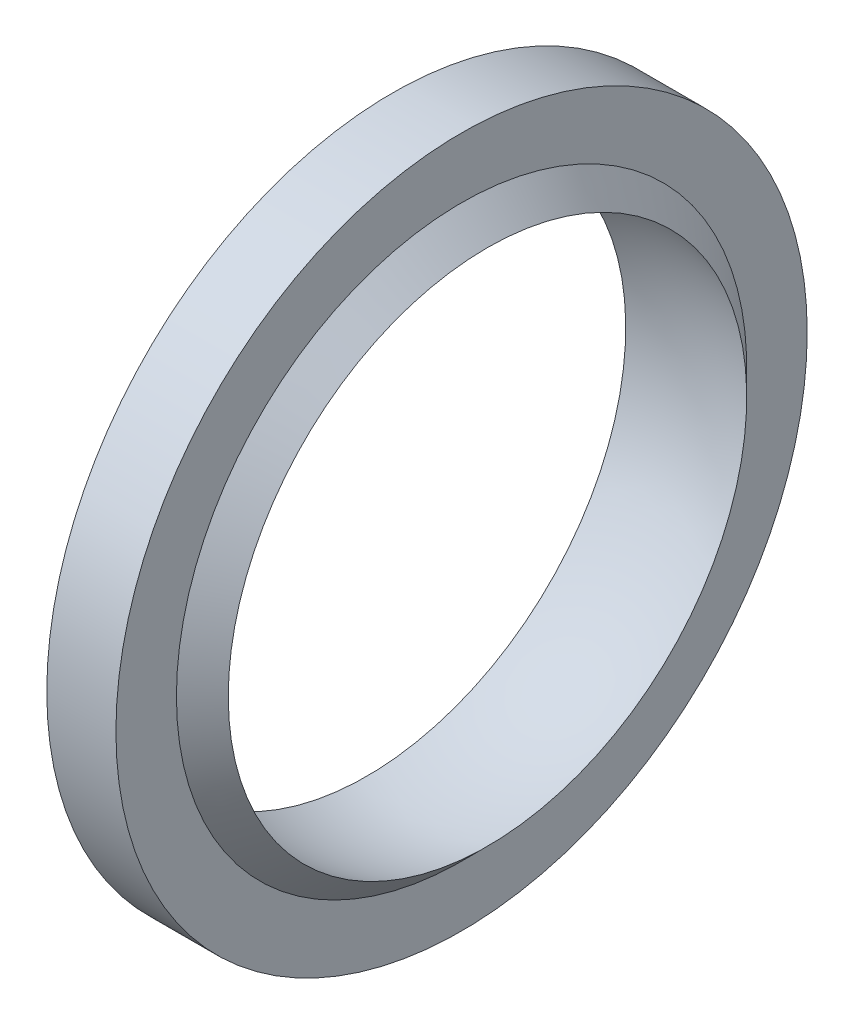
ISO-10303-21;
HEADER;
FILE_DESCRIPTION(('STEP AP214'),'2;1');
FILE_NAME('part.step','',(''),(''),'','','');
FILE_SCHEMA(('AUTOMOTIVE_DESIGN { 1 0 10303 214 1 1 1 1 }'));
ENDSEC;
DATA;
#1=APPLICATION_CONTEXT('core data for automotive mechanical design processes');
#2=APPLICATION_PROTOCOL_DEFINITION('international standard','automotive_design',2000,#1);
#3=PRODUCT_CONTEXT('',#1,'mechanical');
#4=PRODUCT('Part','Part','',(#3));
#5=PRODUCT_RELATED_PRODUCT_CATEGORY('part','',(#4));
#6=PRODUCT_DEFINITION_FORMATION('','',#4);
#7=PRODUCT_DEFINITION_CONTEXT('part definition',#1,'design');
#8=PRODUCT_DEFINITION('design','',#6,#7);
#9=PRODUCT_DEFINITION_SHAPE('','',#8);
#10=(LENGTH_UNIT() NAMED_UNIT(*) SI_UNIT(.MILLI.,.METRE.));
#11=(NAMED_UNIT(*) PLANE_ANGLE_UNIT() SI_UNIT($,.RADIAN.));
#12=(NAMED_UNIT(*) SI_UNIT($,.STERADIAN.) SOLID_ANGLE_UNIT());
#13=UNCERTAINTY_MEASURE_WITH_UNIT(LENGTH_MEASURE(1.E-05),#10,'distance_accuracy_value','');
#14=(GEOMETRIC_REPRESENTATION_CONTEXT(3) GLOBAL_UNCERTAINTY_ASSIGNED_CONTEXT((#13)) GLOBAL_UNIT_ASSIGNED_CONTEXT((#10,
#11,#12)) REPRESENTATION_CONTEXT('',''));
#15=CARTESIAN_POINT('',(0.,0.,0.));
#16=DIRECTION('',(0.,0.,1.));
#17=DIRECTION('',(1.,0.,0.));
#18=AXIS2_PLACEMENT_3D('',#15,#16,#17);
#19=CARTESIAN_POINT('',(-2.,20.,0.));
#20=DIRECTION('',(1.,0.,0.));
#21=DIRECTION('',(0.,0.,-1.));
#22=AXIS2_PLACEMENT_3D('',#19,#20,#21);
#23=PLANE('',#22);
#24=CARTESIAN_POINT('',(-2.,0.,0.));
#25=DIRECTION('',(-1.,0.,0.));
#26=DIRECTION('',(0.,0.,1.));
#27=AXIS2_PLACEMENT_3D('',#24,#25,#26);
#28=CIRCLE('',#27,16.5);
#29=CARTESIAN_POINT('',(-2.,0.,16.5));
#30=VERTEX_POINT('',#29);
#31=EDGE_CURVE('E60',#30,#30,#28,.T.);
#32=ORIENTED_EDGE('',*,*,#31,.F.);
#33=EDGE_LOOP('',(#32));
#34=FACE_BOUND('',#33,.T.);
#35=CARTESIAN_POINT('',(-2.,0.,0.));
#36=DIRECTION('',(-1.,0.,0.));
#37=DIRECTION('',(0.,0.,1.));
#38=AXIS2_PLACEMENT_3D('',#35,#36,#37);
#39=CIRCLE('',#38,20.);
#40=CARTESIAN_POINT('',(-2.,0.,20.));
#41=VERTEX_POINT('',#40);
#42=EDGE_CURVE('E10',#41,#41,#39,.T.);
#43=ORIENTED_EDGE('',*,*,#42,.T.);
#44=EDGE_LOOP('',(#43));
#45=FACE_BOUND('',#44,.T.);
#46=ADVANCED_FACE('F34',(#34,#45),#23,.F.);
#47=CARTESIAN_POINT('',(0.,0.,0.));
#48=DIRECTION('',(-1.,0.,0.));
#49=DIRECTION('',(0.,0.,1.));
#50=AXIS2_PLACEMENT_3D('',#47,#48,#49);
#51=CYLINDRICAL_SURFACE('',#50,20.);
#52=ORIENTED_EDGE('',*,*,#42,.F.);
#53=EDGE_LOOP('',(#52));
#54=FACE_BOUND('',#53,.T.);
#55=CARTESIAN_POINT('',(2.,0.,0.));
#56=DIRECTION('',(-1.,0.,0.));
#57=DIRECTION('',(0.,0.,1.));
#58=AXIS2_PLACEMENT_3D('',#55,#56,#57);
#59=CIRCLE('',#58,20.);
#60=CARTESIAN_POINT('',(2.,0.,20.));
#61=VERTEX_POINT('',#60);
#62=EDGE_CURVE('E41',#61,#61,#59,.T.);
#63=ORIENTED_EDGE('',*,*,#62,.T.);
#64=EDGE_LOOP('',(#63));
#65=FACE_BOUND('',#64,.T.);
#66=ADVANCED_FACE('F65',(#54,#65),#51,.T.);
#67=CARTESIAN_POINT('',(2.,20.,0.));
#68=DIRECTION('',(-1.,0.,0.));
#69=DIRECTION('',(0.,0.,1.));
#70=AXIS2_PLACEMENT_3D('',#67,#68,#69);
#71=PLANE('',#70);
#72=ORIENTED_EDGE('',*,*,#62,.F.);
#73=EDGE_LOOP('',(#72));
#74=FACE_BOUND('',#73,.T.);
#75=CARTESIAN_POINT('',(2.,0.,0.));
#76=DIRECTION('',(-1.,0.,0.));
#77=DIRECTION('',(0.,0.,1.));
#78=AXIS2_PLACEMENT_3D('',#75,#76,#77);
#79=CIRCLE('',#78,16.5);
#80=CARTESIAN_POINT('',(2.,0.,16.5));
#81=VERTEX_POINT('',#80);
#82=EDGE_CURVE('E44',#81,#81,#79,.T.);
#83=ORIENTED_EDGE('',*,*,#82,.T.);
#84=EDGE_LOOP('',(#83));
#85=FACE_BOUND('',#84,.T.);
#86=ADVANCED_FACE('F66',(#74,#85),#71,.F.);
#87=CARTESIAN_POINT('',(3.5,0.,0.));
#88=DIRECTION('',(-1.,0.,0.));
#89=DIRECTION('',(0.,0.,1.));
#90=AXIS2_PLACEMENT_3D('',#87,#88,#89);
#91=CONICAL_SURFACE('',#90,15.,0.785398163397448);
#92=ORIENTED_EDGE('',*,*,#82,.F.);
#93=EDGE_LOOP('',(#92));
#94=FACE_BOUND('',#93,.T.);
#95=CARTESIAN_POINT('',(3.5,0.,0.));
#96=DIRECTION('',(-1.,0.,0.));
#97=DIRECTION('',(0.,0.,1.));
#98=AXIS2_PLACEMENT_3D('',#95,#96,#97);
#99=CIRCLE('',#98,15.);
#100=CARTESIAN_POINT('',(3.5,15.,0.));
#101=VERTEX_POINT('',#100);
#102=EDGE_CURVE('E47',#101,#101,#99,.T.);
#103=ORIENTED_EDGE('',*,*,#102,.T.);
#104=EDGE_LOOP('',(#103));
#105=FACE_BOUND('',#104,.T.);
#106=ADVANCED_FACE('F75',(#94,#105),#91,.T.);
#107=CARTESIAN_POINT('',(0.,0.,0.));
#108=DIRECTION('',(-1.,0.,0.));
#109=DIRECTION('',(0.,1.,0.));
#110=AXIS2_PLACEMENT_3D('',#107,#108,#109);
#111=SPHERICAL_SURFACE('',#110,15.4029218007494);
#112=CARTESIAN_POINT('',(-3.5,0.,0.));
#113=DIRECTION('',(-1.,0.,0.));
#114=DIRECTION('',(0.,0.,1.));
#115=AXIS2_PLACEMENT_3D('',#112,#113,#114);
#116=CIRCLE('',#115,15.);
#117=CARTESIAN_POINT('',(-3.5,15.,0.));
#118=VERTEX_POINT('',#117);
#119=EDGE_CURVE('E53',#118,#118,#116,.T.);
#120=CARTESIAN_POINT('',(3.5,15.,0.));
#121=CARTESIAN_POINT('',(3.42836502915106,15.0167148664133,0.));
#122=CARTESIAN_POINT('',(3.35661030526792,15.0329165012953,0.));
#123=CARTESIAN_POINT('',(3.21287611613927,15.064290149139,0.));
#124=CARTESIAN_POINT('',(3.14089665089377,15.0794621621006,0.));
#125=CARTESIAN_POINT('',(2.99672774374648,15.1087734072453,0.));
#126=CARTESIAN_POINT('',(2.9245383018447,15.1229126394284,0.));
#127=CARTESIAN_POINT('',(2.77996426155114,15.1501554327742,0.));
#128=CARTESIAN_POINT('',(2.70757966315937,15.1632589939369,0.));
#129=CARTESIAN_POINT('',(2.56263016679781,15.1884277524076,0.));
#130=CARTESIAN_POINT('',(2.49006526882803,15.2004929497156,0.));
#131=CARTESIAN_POINT('',(2.34477006811805,15.2235825048421,0.));
#132=CARTESIAN_POINT('',(2.27203976537784,15.2346068626606,0.));
#133=CARTESIAN_POINT('',(2.12642868364768,15.255612475726,0.));
#134=CARTESIAN_POINT('',(2.05354790465773,15.2655937309729,0.));
#135=CARTESIAN_POINT('',(1.90765082989909,15.2845110902113,0.));
#136=CARTESIAN_POINT('',(1.83463453413041,15.2934471942028,0.));
#137=CARTESIAN_POINT('',(1.68848141308437,15.3102724166955,0.));
#138=CARTESIAN_POINT('',(1.61534458780701,15.3181615351966,0.));
#139=CARTESIAN_POINT('',(1.46896541975801,15.332891167398,0.));
#140=CARTESIAN_POINT('',(1.39572307698638,15.3397316810983,0.));
#141=CARTESIAN_POINT('',(1.24914790762048,15.3523626996178,0.));
#142=CARTESIAN_POINT('',(1.17581508102621,15.358153204437,0.));
#143=CARTESIAN_POINT('',(1.02907399625966,15.3686830166396,0.));
#144=CARTESIAN_POINT('',(0.955665738087367,15.3734223240231,0.));
#145=CARTESIAN_POINT('',(0.808788857892321,15.3818487685673,0.));
#146=CARTESIAN_POINT('',(0.735320235869564,15.385535905728,0.));
#147=CARTESIAN_POINT('',(0.588337708091403,15.3918572530076,0.));
#148=CARTESIAN_POINT('',(0.514823802335999,15.3944914631265,0.));
#149=CARTESIAN_POINT('',(0.367765796505265,15.3987064156262,0.));
#150=CARTESIAN_POINT('',(0.294221696429935,15.400287158007,0.));
#151=CARTESIAN_POINT('',(0.147118397569737,15.4023948505686,0.));
#152=CARTESIAN_POINT('',(0.0735591987848688,15.4029218007494,0.));
#153=CARTESIAN_POINT('',(-0.0735591987848671,15.4029218007494,0.));
#154=CARTESIAN_POINT('',(-0.147118397569735,15.4023948505686,0.));
#155=CARTESIAN_POINT('',(-0.294221696429933,15.400287158007,0.));
#156=CARTESIAN_POINT('',(-0.367765796505263,15.3987064156262,0.));
#157=CARTESIAN_POINT('',(-0.514823802335997,15.3944914631265,0.));
#158=CARTESIAN_POINT('',(-0.588337708091401,15.3918572530076,0.));
#159=CARTESIAN_POINT('',(-0.735320235869562,15.385535905728,0.));
#160=CARTESIAN_POINT('',(-0.808788857892319,15.3818487685673,0.));
#161=CARTESIAN_POINT('',(-0.955665738087365,15.3734223240231,0.));
#162=CARTESIAN_POINT('',(-1.02907399625965,15.3686830166396,0.));
#163=CARTESIAN_POINT('',(-1.17581508102621,15.358153204437,0.));
#164=CARTESIAN_POINT('',(-1.24914790762048,15.3523626996178,0.));
#165=CARTESIAN_POINT('',(-1.39572307698638,15.3397316810983,0.));
#166=CARTESIAN_POINT('',(-1.46896541975801,15.332891167398,0.));
#167=CARTESIAN_POINT('',(-1.615344587807,15.3181615351966,0.));
#168=CARTESIAN_POINT('',(-1.68848141308437,15.3102724166955,0.));
#169=CARTESIAN_POINT('',(-1.83463453413041,15.2934471942028,0.));
#170=CARTESIAN_POINT('',(-1.90765082989909,15.2845110902113,0.));
#171=CARTESIAN_POINT('',(-2.05354790465773,15.2655937309729,0.));
#172=CARTESIAN_POINT('',(-2.12642868364768,15.255612475726,0.));
#173=CARTESIAN_POINT('',(-2.27203976537784,15.2346068626606,0.));
#174=CARTESIAN_POINT('',(-2.34477006811805,15.2235825048421,0.));
#175=CARTESIAN_POINT('',(-2.49006526882803,15.2004929497156,0.));
#176=CARTESIAN_POINT('',(-2.56263016679781,15.1884277524076,0.));
#177=CARTESIAN_POINT('',(-2.70757966315937,15.1632589939369,0.));
#178=CARTESIAN_POINT('',(-2.77996426155114,15.1501554327742,0.));
#179=CARTESIAN_POINT('',(-2.9245383018447,15.1229126394284,0.));
#180=CARTESIAN_POINT('',(-2.99672774374648,15.1087734072453,0.));
#181=CARTESIAN_POINT('',(-3.14089665089377,15.0794621621006,0.));
#182=CARTESIAN_POINT('',(-3.21287611613927,15.064290149139,0.));
#183=CARTESIAN_POINT('',(-3.35661030526791,15.0329165012953,0.));
#184=CARTESIAN_POINT('',(-3.42836502915106,15.0167148664133,0.));
#185=CARTESIAN_POINT('',(-3.5,15.,0.));
#186=B_SPLINE_CURVE_WITH_KNOTS('',3,(#120,#121,#122,#123,#124,#125,#126,#127,#128,#129,#130,
#131,#132,#133,#134,#135,#136,#137,#138,#139,#140,#141,#142,#143,#144,#145,#146,#147,#148,#149,
#150,#151,#152,#153,#154,#155,#156,#157,#158,#159,#160,#161,#162,#163,#164,#165,#166,#167,#168,
#169,#170,#171,#172,#173,#174,#175,#176,#177,#178,#179,#180,#181,#182,#183,#184,#185),
.UNSPECIFIED.,.F.,.F.,(4,2,2,2,2,2,2,2,2,2,2,2,2,2,2,2,2,2,2,2,2,2,2,2,2,2,2,2,2,2,2,2,4),(0.,
0.220675709040126,0.441351418080251,0.662027127120377,0.882702836160503,1.10337854520063,
1.32405425424075,1.54472996328088,1.76540567232101,1.98608138136113,2.20675709040126,
2.42743279944138,2.64810850848151,2.86878421752164,3.08945992656176,3.31013563560189,
3.53081134464201,3.75148705368214,3.97216276272227,4.19283847176239,4.41351418080252,
4.63418988984264,4.85486559888277,5.07554130792289,5.29621701696302,5.51689272600315,
5.73756843504327,5.9582441440834,6.17891985312352,6.39959556216365,6.62027127120378,
6.8409469802439,7.06162268928403),.UNSPECIFIED.);
#187=EDGE_CURVE('BSEAM80',#101,#118,#186,.T.);
#188=ORIENTED_EDGE('',*,*,#102,.F.);
#189=ORIENTED_EDGE('',*,*,#119,.T.);
#190=ORIENTED_EDGE('',*,*,#187,.T.);
#191=ORIENTED_EDGE('',*,*,#187,.F.);
#192=EDGE_LOOP('',(#188,#190,#189,#191));
#193=FACE_BOUND('',#192,.T.);
#194=ADVANCED_FACE('F80',(#193),#111,.F.);
#195=CARTESIAN_POINT('',(-2.,0.,0.));
#196=DIRECTION('',(1.,0.,0.));
#197=DIRECTION('',(0.,0.,-1.));
#198=AXIS2_PLACEMENT_3D('',#195,#196,#197);
#199=CONICAL_SURFACE('',#198,16.5,0.78539816339745);
#200=ORIENTED_EDGE('',*,*,#119,.F.);
#201=EDGE_LOOP('',(#200));
#202=FACE_BOUND('',#201,.T.);
#203=ORIENTED_EDGE('',*,*,#31,.T.);
#204=EDGE_LOOP('',(#203));
#205=FACE_BOUND('',#204,.T.);
#206=ADVANCED_FACE('F63',(#202,#205),#199,.T.);
#207=CLOSED_SHELL('',(#46,#66,#86,#106,#194,#206));
#208=MANIFOLD_SOLID_BREP('B2',#207);
#209=ADVANCED_BREP_SHAPE_REPRESENTATION('',(#18,#208),#14);
#210=SHAPE_DEFINITION_REPRESENTATION(#9,#209);
ENDSEC;
END-ISO-10303-21;
